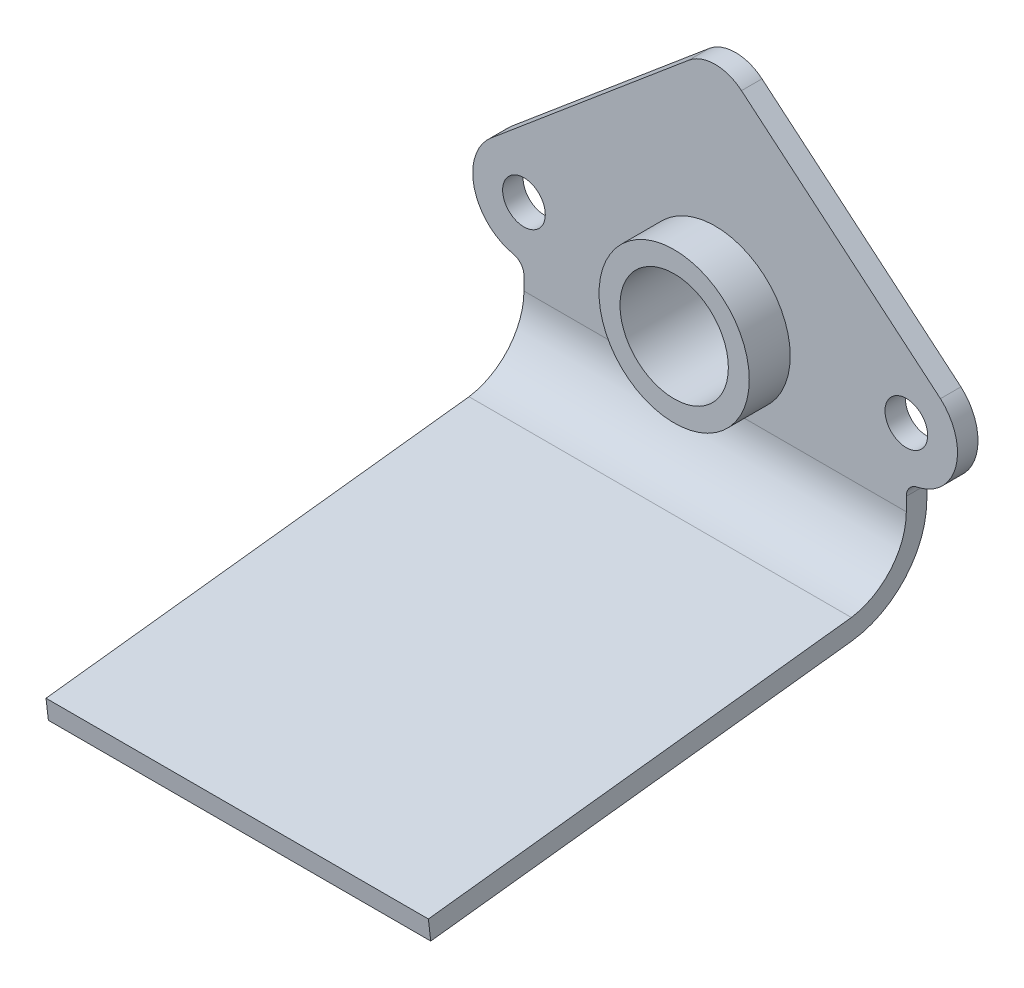
ISO-10303-21;
HEADER;
FILE_DESCRIPTION(('STEP AP214'),'2;1');
FILE_NAME('part.step','',(''),(''),'','','');
FILE_SCHEMA(('AUTOMOTIVE_DESIGN { 1 0 10303 214 1 1 1 1 }'));
ENDSEC;
DATA;
#1=APPLICATION_CONTEXT('core data for automotive mechanical design processes');
#2=APPLICATION_PROTOCOL_DEFINITION('international standard','automotive_design',2000,#1);
#3=PRODUCT_CONTEXT('',#1,'mechanical');
#4=PRODUCT('Part','Part','',(#3));
#5=PRODUCT_RELATED_PRODUCT_CATEGORY('part','',(#4));
#6=PRODUCT_DEFINITION_FORMATION('','',#4);
#7=PRODUCT_DEFINITION_CONTEXT('part definition',#1,'design');
#8=PRODUCT_DEFINITION('design','',#6,#7);
#9=PRODUCT_DEFINITION_SHAPE('','',#8);
#10=(LENGTH_UNIT() NAMED_UNIT(*) SI_UNIT(.MILLI.,.METRE.));
#11=(NAMED_UNIT(*) PLANE_ANGLE_UNIT() SI_UNIT($,.RADIAN.));
#12=(NAMED_UNIT(*) SI_UNIT($,.STERADIAN.) SOLID_ANGLE_UNIT());
#13=UNCERTAINTY_MEASURE_WITH_UNIT(LENGTH_MEASURE(1.E-05),#10,'distance_accuracy_value','');
#14=(GEOMETRIC_REPRESENTATION_CONTEXT(3) GLOBAL_UNCERTAINTY_ASSIGNED_CONTEXT((#13)) GLOBAL_UNIT_ASSIGNED_CONTEXT((#10,
#11,#12)) REPRESENTATION_CONTEXT('',''));
#15=CARTESIAN_POINT('',(0.,0.,0.));
#16=DIRECTION('',(0.,0.,1.));
#17=DIRECTION('',(1.,0.,0.));
#18=AXIS2_PLACEMENT_3D('',#15,#16,#17);
#19=CARTESIAN_POINT('',(0.,0.,3.));
#20=DIRECTION('',(0.,0.,1.));
#21=DIRECTION('',(1.,0.,0.));
#22=AXIS2_PLACEMENT_3D('',#19,#20,#21);
#23=PLANE('',#22);
#24=DIRECTION('',(0.,-1.,0.));
#25=VECTOR('',#24,1.);
#26=CARTESIAN_POINT('',(28.,0.,3.));
#27=LINE('',#26,#25);
#28=CARTESIAN_POINT('',(28.,-9.28708781050336,3.));
#29=VERTEX_POINT('',#28);
#30=CARTESIAN_POINT('',(28.,-11.25,3.));
#31=VERTEX_POINT('',#30);
#32=EDGE_CURVE('E228',#29,#31,#27,.T.);
#33=ORIENTED_EDGE('',*,*,#32,.F.);
#34=CARTESIAN_POINT('',(30.,-9.28708781050336,3.));
#35=DIRECTION('',(0.,0.,1.));
#36=DIRECTION('',(1.,0.,0.));
#37=AXIS2_PLACEMENT_3D('',#34,#35,#36);
#38=CIRCLE('',#37,2.);
#39=CARTESIAN_POINT('',(29.5789473684211,-7.33191142934476,3.));
#40=VERTEX_POINT('',#39);
#41=EDGE_CURVE('E325',#29,#40,#38,.F.);
#42=ORIENTED_EDGE('',*,*,#41,.T.);
#43=CARTESIAN_POINT('',(28.,0.,3.));
#44=DIRECTION('',(0.,0.,1.));
#45=DIRECTION('',(1.,0.,0.));
#46=AXIS2_PLACEMENT_3D('',#43,#44,#45);
#47=CIRCLE('',#46,7.5);
#48=CARTESIAN_POINT('',(32.9978334745954,5.5921069875507,3.));
#49=VERTEX_POINT('',#48);
#50=EDGE_CURVE('E231',#40,#49,#47,.T.);
#51=ORIENTED_EDGE('',*,*,#50,.T.);
#52=DIRECTION('',(0.765373193581279,-0.6435867265157,0.));
#53=VECTOR('',#52,1.);
#54=CARTESIAN_POINT('',(16.4224130630046,19.5300403418685,3.));
#55=LINE('',#54,#53);
#56=CARTESIAN_POINT('',(3.86110629673899,30.0925873062232,3.));
#57=VERTEX_POINT('',#56);
#58=EDGE_CURVE('E234',#57,#49,#55,.T.);
#59=ORIENTED_EDGE('',*,*,#58,.F.);
#60=CARTESIAN_POINT('',(0.,25.5,3.));
#61=DIRECTION('',(0.,0.,1.));
#62=DIRECTION('',(1.,0.,0.));
#63=AXIS2_PLACEMENT_3D('',#60,#61,#62);
#64=CIRCLE('',#63,6.);
#65=CARTESIAN_POINT('',(-3.86110629673899,30.0925873062232,3.));
#66=VERTEX_POINT('',#65);
#67=EDGE_CURVE('E238',#57,#66,#64,.T.);
#68=ORIENTED_EDGE('',*,*,#67,.T.);
#69=DIRECTION('',(-0.765431217703868,-0.643517716123165,0.));
#70=VECTOR('',#69,1.);
#71=CARTESIAN_POINT('',(-16.4216042979262,19.5326535066317,3.));
#72=LINE('',#71,#70);
#73=CARTESIAN_POINT('',(-32.8263828709237,5.74073413277901,3.));
#74=VERTEX_POINT('',#73);
#75=EDGE_CURVE('E242',#66,#74,#72,.T.);
#76=ORIENTED_EDGE('',*,*,#75,.T.);
#77=CARTESIAN_POINT('',(-28.,0.,3.));
#78=DIRECTION('',(0.,0.,1.));
#79=DIRECTION('',(1.,0.,0.));
#80=AXIS2_PLACEMENT_3D('',#77,#78,#79);
#81=CIRCLE('',#80,7.5);
#82=CARTESIAN_POINT('',(-29.5789473684211,-7.33191142934475,3.));
#83=VERTEX_POINT('',#82);
#84=EDGE_CURVE('E246',#74,#83,#81,.T.);
#85=ORIENTED_EDGE('',*,*,#84,.T.);
#86=CARTESIAN_POINT('',(-30.,-9.28708781050335,3.));
#87=DIRECTION('',(0.,0.,1.));
#88=DIRECTION('',(1.,0.,0.));
#89=AXIS2_PLACEMENT_3D('',#86,#87,#88);
#90=CIRCLE('',#89,2.);
#91=CARTESIAN_POINT('',(-28.,-9.28708781050335,3.));
#92=VERTEX_POINT('',#91);
#93=EDGE_CURVE('E12',#83,#92,#90,.F.);
#94=ORIENTED_EDGE('',*,*,#93,.T.);
#95=DIRECTION('',(0.,-1.,0.));
#96=VECTOR('',#95,1.);
#97=CARTESIAN_POINT('',(-28.,0.,3.));
#98=LINE('',#97,#96);
#99=CARTESIAN_POINT('',(-28.,-11.25,3.));
#100=VERTEX_POINT('',#99);
#101=EDGE_CURVE('E249',#92,#100,#98,.T.);
#102=ORIENTED_EDGE('',*,*,#101,.T.);
#103=DIRECTION('',(1.,0.,0.));
#104=VECTOR('',#103,1.);
#105=CARTESIAN_POINT('',(0.,-11.25,3.));
#106=LINE('',#105,#104);
#107=EDGE_CURVE('E252',#100,#31,#106,.T.);
#108=ORIENTED_EDGE('',*,*,#107,.T.);
#109=EDGE_LOOP('',(#33,#42,#51,#59,#68,#76,#85,#94,#102,#108));
#110=FACE_BOUND('',#109,.T.);
#111=CARTESIAN_POINT('',(28.,0.,3.));
#112=DIRECTION('',(0.,0.,1.));
#113=DIRECTION('',(1.,0.,0.));
#114=AXIS2_PLACEMENT_3D('',#111,#112,#113);
#115=CIRCLE('',#114,3.125);
#116=CARTESIAN_POINT('',(31.125,0.,3.));
#117=VERTEX_POINT('',#116);
#118=EDGE_CURVE('E223',#117,#117,#115,.T.);
#119=ORIENTED_EDGE('',*,*,#118,.F.);
#120=EDGE_LOOP('',(#119));
#121=FACE_BOUND('',#120,.T.);
#122=CARTESIAN_POINT('',(-28.,0.,3.));
#123=DIRECTION('',(0.,0.,1.));
#124=DIRECTION('',(1.,0.,0.));
#125=AXIS2_PLACEMENT_3D('',#122,#123,#124);
#126=CIRCLE('',#125,3.125);
#127=CARTESIAN_POINT('',(-24.875,0.,3.));
#128=VERTEX_POINT('',#127);
#129=EDGE_CURVE('E219',#128,#128,#126,.T.);
#130=ORIENTED_EDGE('',*,*,#129,.F.);
#131=EDGE_LOOP('',(#130));
#132=FACE_BOUND('',#131,.T.);
#133=CARTESIAN_POINT('',(0.,0.,3.));
#134=DIRECTION('',(0.,0.,1.));
#135=DIRECTION('',(1.,0.,0.));
#136=AXIS2_PLACEMENT_3D('',#133,#134,#135);
#137=CIRCLE('',#136,11.);
#138=CARTESIAN_POINT('',(11.,0.,3.));
#139=VERTEX_POINT('',#138);
#140=EDGE_CURVE('E202',#139,#139,#137,.T.);
#141=ORIENTED_EDGE('',*,*,#140,.F.);
#142=EDGE_LOOP('',(#141));
#143=FACE_BOUND('',#142,.T.);
#144=ADVANCED_FACE('F52',(#110,#121,#132,#143),#23,.T.);
#145=CARTESIAN_POINT('',(0.,0.,0.));
#146=DIRECTION('',(0.,0.,1.));
#147=DIRECTION('',(1.,0.,0.));
#148=AXIS2_PLACEMENT_3D('',#145,#146,#147);
#149=PLANE('',#148);
#150=CARTESIAN_POINT('',(28.,0.,0.));
#151=DIRECTION('',(0.,0.,1.));
#152=DIRECTION('',(1.,0.,0.));
#153=AXIS2_PLACEMENT_3D('',#150,#151,#152);
#154=CIRCLE('',#153,7.5);
#155=CARTESIAN_POINT('',(29.5789473684211,-7.33191142934476,0.));
#156=VERTEX_POINT('',#155);
#157=CARTESIAN_POINT('',(32.9978334745954,5.5921069875507,0.));
#158=VERTEX_POINT('',#157);
#159=EDGE_CURVE('E267',#156,#158,#154,.T.);
#160=ORIENTED_EDGE('',*,*,#159,.F.);
#161=CARTESIAN_POINT('',(30.,-9.28708781050336,0.));
#162=DIRECTION('',(0.,0.,1.));
#163=DIRECTION('',(1.,0.,0.));
#164=AXIS2_PLACEMENT_3D('',#161,#162,#163);
#165=CIRCLE('',#164,2.);
#166=CARTESIAN_POINT('',(28.,-9.28708781050336,0.));
#167=VERTEX_POINT('',#166);
#168=EDGE_CURVE('E322',#156,#167,#165,.T.);
#169=ORIENTED_EDGE('',*,*,#168,.T.);
#170=DIRECTION('',(0.,-1.,0.));
#171=VECTOR('',#170,1.);
#172=CARTESIAN_POINT('',(28.,0.,0.));
#173=LINE('',#172,#171);
#174=CARTESIAN_POINT('',(28.,-11.25,0.));
#175=VERTEX_POINT('',#174);
#176=EDGE_CURVE('E264',#167,#175,#173,.T.);
#177=ORIENTED_EDGE('',*,*,#176,.T.);
#178=DIRECTION('',(1.,0.,0.));
#179=VECTOR('',#178,1.);
#180=CARTESIAN_POINT('',(0.,-11.25,0.));
#181=LINE('',#180,#179);
#182=CARTESIAN_POINT('',(-28.,-11.2500000000001,0.));
#183=VERTEX_POINT('',#182);
#184=EDGE_CURVE('E224',#183,#175,#181,.T.);
#185=ORIENTED_EDGE('',*,*,#184,.F.);
#186=DIRECTION('',(0.,-1.,0.));
#187=VECTOR('',#186,1.);
#188=CARTESIAN_POINT('',(-28.,0.,0.));
#189=LINE('',#188,#187);
#190=CARTESIAN_POINT('',(-28.,-9.28708781050335,0.));
#191=VERTEX_POINT('',#190);
#192=EDGE_CURVE('E285',#191,#183,#189,.T.);
#193=ORIENTED_EDGE('',*,*,#192,.F.);
#194=CARTESIAN_POINT('',(-30.,-9.28708781050335,0.));
#195=DIRECTION('',(0.,0.,1.));
#196=DIRECTION('',(1.,0.,0.));
#197=AXIS2_PLACEMENT_3D('',#194,#195,#196);
#198=CIRCLE('',#197,2.);
#199=CARTESIAN_POINT('',(-29.5789473684211,-7.33191142934475,0.));
#200=VERTEX_POINT('',#199);
#201=EDGE_CURVE('E61',#191,#200,#198,.T.);
#202=ORIENTED_EDGE('',*,*,#201,.T.);
#203=CARTESIAN_POINT('',(-28.,0.,0.));
#204=DIRECTION('',(0.,0.,1.));
#205=DIRECTION('',(1.,0.,0.));
#206=AXIS2_PLACEMENT_3D('',#203,#204,#205);
#207=CIRCLE('',#206,7.5);
#208=CARTESIAN_POINT('',(-32.8263828709237,5.74073413277901,0.));
#209=VERTEX_POINT('',#208);
#210=EDGE_CURVE('E282',#209,#200,#207,.T.);
#211=ORIENTED_EDGE('',*,*,#210,.F.);
#212=DIRECTION('',(-0.765431217703868,-0.643517716123165,0.));
#213=VECTOR('',#212,1.);
#214=CARTESIAN_POINT('',(-16.4216042979262,19.5326535066317,0.));
#215=LINE('',#214,#213);
#216=CARTESIAN_POINT('',(-3.86110629673899,30.0925873062232,0.));
#217=VERTEX_POINT('',#216);
#218=EDGE_CURVE('E278',#217,#209,#215,.T.);
#219=ORIENTED_EDGE('',*,*,#218,.F.);
#220=CARTESIAN_POINT('',(0.,25.5,0.));
#221=DIRECTION('',(0.,0.,1.));
#222=DIRECTION('',(1.,0.,0.));
#223=AXIS2_PLACEMENT_3D('',#220,#221,#222);
#224=CIRCLE('',#223,6.);
#225=CARTESIAN_POINT('',(3.86110629673899,30.0925873062232,0.));
#226=VERTEX_POINT('',#225);
#227=EDGE_CURVE('E274',#226,#217,#224,.T.);
#228=ORIENTED_EDGE('',*,*,#227,.F.);
#229=DIRECTION('',(0.765373193581279,-0.6435867265157,0.));
#230=VECTOR('',#229,1.);
#231=CARTESIAN_POINT('',(16.4224130630046,19.5300403418685,0.));
#232=LINE('',#231,#230);
#233=EDGE_CURVE('E270',#226,#158,#232,.T.);
#234=ORIENTED_EDGE('',*,*,#233,.T.);
#235=EDGE_LOOP('',(#160,#169,#177,#185,#193,#202,#211,#219,#228,#234));
#236=FACE_BOUND('',#235,.T.);
#237=CARTESIAN_POINT('',(28.,0.,0.));
#238=DIRECTION('',(0.,0.,1.));
#239=DIRECTION('',(1.,0.,0.));
#240=AXIS2_PLACEMENT_3D('',#237,#238,#239);
#241=CIRCLE('',#240,3.125);
#242=CARTESIAN_POINT('',(31.125,0.,0.));
#243=VERTEX_POINT('',#242);
#244=EDGE_CURVE('E260',#243,#243,#241,.T.);
#245=ORIENTED_EDGE('',*,*,#244,.T.);
#246=EDGE_LOOP('',(#245));
#247=FACE_BOUND('',#246,.T.);
#248=CARTESIAN_POINT('',(-28.,0.,0.));
#249=DIRECTION('',(0.,0.,1.));
#250=DIRECTION('',(1.,0.,0.));
#251=AXIS2_PLACEMENT_3D('',#248,#249,#250);
#252=CIRCLE('',#251,3.125);
#253=CARTESIAN_POINT('',(-24.875,0.,0.));
#254=VERTEX_POINT('',#253);
#255=EDGE_CURVE('E218',#254,#254,#252,.T.);
#256=ORIENTED_EDGE('',*,*,#255,.T.);
#257=EDGE_LOOP('',(#256));
#258=FACE_BOUND('',#257,.T.);
#259=CARTESIAN_POINT('',(0.,0.,0.));
#260=DIRECTION('',(0.,0.,1.));
#261=DIRECTION('',(1.,0.,0.));
#262=AXIS2_PLACEMENT_3D('',#259,#260,#261);
#263=CIRCLE('',#262,11.);
#264=CARTESIAN_POINT('',(11.,0.,0.));
#265=VERTEX_POINT('',#264);
#266=EDGE_CURVE('E305',#265,#265,#263,.F.);
#267=ORIENTED_EDGE('',*,*,#266,.F.);
#268=EDGE_LOOP('',(#267));
#269=FACE_BOUND('',#268,.T.);
#270=ADVANCED_FACE('F358',(#236,#247,#258,#269),#149,.F.);
#271=CARTESIAN_POINT('',(28.,0.,3.));
#272=DIRECTION('',(1.,0.,0.));
#273=DIRECTION('',(0.,0.,-1.));
#274=AXIS2_PLACEMENT_3D('',#271,#272,#273);
#275=PLANE('',#274);
#276=ORIENTED_EDGE('',*,*,#176,.F.);
#277=DIRECTION('',(0.,0.,-1.));
#278=VECTOR('',#277,1.);
#279=CARTESIAN_POINT('',(28.,-9.28708781050336,3.));
#280=LINE('',#279,#278);
#281=EDGE_CURVE('E313',#167,#29,#280,.F.);
#282=ORIENTED_EDGE('',*,*,#281,.T.);
#283=ORIENTED_EDGE('',*,*,#32,.T.);
#284=CARTESIAN_POINT('',(28.,-11.25,12.5));
#285=DIRECTION('',(1.,0.,0.));
#286=DIRECTION('',(0.,0.,-1.));
#287=AXIS2_PLACEMENT_3D('',#284,#285,#286);
#288=CIRCLE('',#287,9.5);
#289=CARTESIAN_POINT('',(28.,-20.6380832623958,11.0460768045307));
#290=VERTEX_POINT('',#289);
#291=EDGE_CURVE('E181',#31,#290,#288,.F.);
#292=ORIENTED_EDGE('',*,*,#291,.T.);
#293=DIRECTION('',(0.,0.116417778690367,-0.993200332664464));
#294=VECTOR('',#293,1.);
#295=CARTESIAN_POINT('',(28.,-27.9,73.));
#296=LINE('',#295,#294);
#297=CARTESIAN_POINT('',(28.,-27.9,73.));
#298=VERTEX_POINT('',#297);
#299=EDGE_CURVE('E170',#298,#290,#296,.T.);
#300=ORIENTED_EDGE('',*,*,#299,.F.);
#301=DIRECTION('',(0.,-0.993212508472749,-0.11631385563754));
#302=VECTOR('',#301,1.);
#303=CARTESIAN_POINT('',(28.,-27.9,73.));
#304=LINE('',#303,#302);
#305=CARTESIAN_POINT('',(28.,-30.8796375254182,72.6510584330874));
#306=VERTEX_POINT('',#305);
#307=EDGE_CURVE('E152',#298,#306,#304,.T.);
#308=ORIENTED_EDGE('',*,*,#307,.T.);
#309=DIRECTION('',(0.,0.11631385563754,-0.993212508472749));
#310=VECTOR('',#309,1.);
#311=CARTESIAN_POINT('',(28.,-30.8796375254182,72.6510584330874));
#312=LINE('',#311,#310);
#313=CARTESIAN_POINT('',(28.,-23.6651563559094,11.0460768045307));
#314=VERTEX_POINT('',#313);
#315=EDGE_CURVE('E163',#306,#314,#312,.T.);
#316=ORIENTED_EDGE('',*,*,#315,.T.);
#317=CARTESIAN_POINT('',(28.,-11.25,12.5));
#318=DIRECTION('',(1.,0.,0.));
#319=DIRECTION('',(0.,0.,-1.));
#320=AXIS2_PLACEMENT_3D('',#317,#318,#319);
#321=CIRCLE('',#320,12.5000000000001);
#322=EDGE_CURVE('E197',#175,#314,#321,.F.);
#323=ORIENTED_EDGE('',*,*,#322,.F.);
#324=EDGE_LOOP('',(#276,#282,#283,#292,#300,#308,#316,#323));
#325=FACE_BOUND('',#324,.T.);
#326=ADVANCED_FACE('F179',(#325),#275,.T.);
#327=CARTESIAN_POINT('',(28.,0.,3.));
#328=DIRECTION('',(0.,0.,-1.));
#329=DIRECTION('',(-1.,0.,0.));
#330=AXIS2_PLACEMENT_3D('',#327,#328,#329);
#331=CYLINDRICAL_SURFACE('',#330,7.5);
#332=ORIENTED_EDGE('',*,*,#50,.F.);
#333=DIRECTION('',(0.,0.,-1.));
#334=VECTOR('',#333,1.);
#335=CARTESIAN_POINT('',(29.5789473684211,-7.33191142934476,3.));
#336=LINE('',#335,#334);
#337=EDGE_CURVE('E309',#40,#156,#336,.T.);
#338=ORIENTED_EDGE('',*,*,#337,.T.);
#339=ORIENTED_EDGE('',*,*,#159,.T.);
#340=DIRECTION('',(0.,0.,-1.));
#341=VECTOR('',#340,1.);
#342=CARTESIAN_POINT('',(32.9978334745954,5.5921069875507,3.));
#343=LINE('',#342,#341);
#344=EDGE_CURVE('E301',#49,#158,#343,.T.);
#345=ORIENTED_EDGE('',*,*,#344,.F.);
#346=EDGE_LOOP('',(#332,#338,#339,#345));
#347=FACE_BOUND('',#346,.T.);
#348=ADVANCED_FACE('F366',(#347),#331,.T.);
#349=CARTESIAN_POINT('',(16.4224130630046,19.5300403418685,3.));
#350=DIRECTION('',(0.6435867265157,0.765373193581279,0.));
#351=DIRECTION('',(-0.765373193581279,0.6435867265157,0.));
#352=AXIS2_PLACEMENT_3D('',#349,#350,#351);
#353=PLANE('',#352);
#354=ORIENTED_EDGE('',*,*,#233,.F.);
#355=DIRECTION('',(0.,0.,-1.));
#356=VECTOR('',#355,1.);
#357=CARTESIAN_POINT('',(3.86110629673899,30.0925873062232,3.));
#358=LINE('',#357,#356);
#359=EDGE_CURVE('E298',#57,#226,#358,.T.);
#360=ORIENTED_EDGE('',*,*,#359,.F.);
#361=ORIENTED_EDGE('',*,*,#58,.T.);
#362=ORIENTED_EDGE('',*,*,#344,.T.);
#363=EDGE_LOOP('',(#354,#360,#361,#362));
#364=FACE_BOUND('',#363,.T.);
#365=ADVANCED_FACE('F388',(#364),#353,.T.);
#366=CARTESIAN_POINT('',(0.,25.5,3.));
#367=DIRECTION('',(0.,0.,-1.));
#368=DIRECTION('',(-1.,0.,0.));
#369=AXIS2_PLACEMENT_3D('',#366,#367,#368);
#370=CYLINDRICAL_SURFACE('',#369,6.);
#371=ORIENTED_EDGE('',*,*,#227,.T.);
#372=DIRECTION('',(0.,0.,-1.));
#373=VECTOR('',#372,1.);
#374=CARTESIAN_POINT('',(-3.86110629673899,30.0925873062232,3.));
#375=LINE('',#374,#373);
#376=EDGE_CURVE('E294',#66,#217,#375,.T.);
#377=ORIENTED_EDGE('',*,*,#376,.F.);
#378=ORIENTED_EDGE('',*,*,#67,.F.);
#379=ORIENTED_EDGE('',*,*,#359,.T.);
#380=EDGE_LOOP('',(#371,#377,#378,#379));
#381=FACE_BOUND('',#380,.T.);
#382=ADVANCED_FACE('F390',(#381),#370,.T.);
#383=CARTESIAN_POINT('',(-16.4216042979262,19.5326535066317,3.));
#384=DIRECTION('',(0.643517716123165,-0.765431217703867,0.));
#385=DIRECTION('',(0.765431217703868,0.643517716123165,0.));
#386=AXIS2_PLACEMENT_3D('',#383,#384,#385);
#387=PLANE('',#386);
#388=ORIENTED_EDGE('',*,*,#218,.T.);
#389=DIRECTION('',(0.,0.,-1.));
#390=VECTOR('',#389,1.);
#391=CARTESIAN_POINT('',(-32.8263828709237,5.74073413277901,3.));
#392=LINE('',#391,#390);
#393=EDGE_CURVE('E256',#74,#209,#392,.T.);
#394=ORIENTED_EDGE('',*,*,#393,.F.);
#395=ORIENTED_EDGE('',*,*,#75,.F.);
#396=ORIENTED_EDGE('',*,*,#376,.T.);
#397=EDGE_LOOP('',(#388,#394,#395,#396));
#398=FACE_BOUND('',#397,.T.);
#399=ADVANCED_FACE('F382',(#398),#387,.F.);
#400=CARTESIAN_POINT('',(-28.,0.,3.));
#401=DIRECTION('',(0.,0.,-1.));
#402=DIRECTION('',(-1.,0.,0.));
#403=AXIS2_PLACEMENT_3D('',#400,#401,#402);
#404=CYLINDRICAL_SURFACE('',#403,7.5);
#405=ORIENTED_EDGE('',*,*,#210,.T.);
#406=DIRECTION('',(0.,0.,-1.));
#407=VECTOR('',#406,1.);
#408=CARTESIAN_POINT('',(-29.5789473684211,-7.33191142934475,3.));
#409=LINE('',#408,#407);
#410=EDGE_CURVE('E68',#200,#83,#409,.F.);
#411=ORIENTED_EDGE('',*,*,#410,.T.);
#412=ORIENTED_EDGE('',*,*,#84,.F.);
#413=ORIENTED_EDGE('',*,*,#393,.T.);
#414=EDGE_LOOP('',(#405,#411,#412,#413));
#415=FACE_BOUND('',#414,.T.);
#416=ADVANCED_FACE('F380',(#415),#404,.T.);
#417=CARTESIAN_POINT('',(-28.,0.,3.));
#418=DIRECTION('',(1.,0.,0.));
#419=DIRECTION('',(0.,0.,-1.));
#420=AXIS2_PLACEMENT_3D('',#417,#418,#419);
#421=PLANE('',#420);
#422=ORIENTED_EDGE('',*,*,#101,.F.);
#423=DIRECTION('',(0.,0.,1.));
#424=VECTOR('',#423,1.);
#425=CARTESIAN_POINT('',(-28.,-9.28708781050335,0.));
#426=LINE('',#425,#424);
#427=EDGE_CURVE('E316',#92,#191,#426,.F.);
#428=ORIENTED_EDGE('',*,*,#427,.T.);
#429=ORIENTED_EDGE('',*,*,#192,.T.);
#430=CARTESIAN_POINT('',(-28.,-11.25,12.5));
#431=DIRECTION('',(-1.,0.,0.));
#432=DIRECTION('',(0.,0.,1.));
#433=AXIS2_PLACEMENT_3D('',#430,#431,#432);
#434=CIRCLE('',#433,12.5000000000001);
#435=CARTESIAN_POINT('',(-28.,-23.6651563559094,11.0460768045307));
#436=VERTEX_POINT('',#435);
#437=EDGE_CURVE('E164',#183,#436,#434,.T.);
#438=ORIENTED_EDGE('',*,*,#437,.T.);
#439=DIRECTION('',(0.,0.11631385563754,-0.993212508472748));
#440=VECTOR('',#439,1.);
#441=CARTESIAN_POINT('',(-28.,-30.8796375254182,72.6510584330874));
#442=LINE('',#441,#440);
#443=CARTESIAN_POINT('',(-28.,-30.8796375254182,72.6510584330874));
#444=VERTEX_POINT('',#443);
#445=EDGE_CURVE('E193',#444,#436,#442,.T.);
#446=ORIENTED_EDGE('',*,*,#445,.F.);
#447=DIRECTION('',(0.,-0.993212508472749,-0.11631385563754));
#448=VECTOR('',#447,1.);
#449=CARTESIAN_POINT('',(-28.,-27.9,73.));
#450=LINE('',#449,#448);
#451=CARTESIAN_POINT('',(-28.,-27.9,73.));
#452=VERTEX_POINT('',#451);
#453=EDGE_CURVE('E175',#452,#444,#450,.T.);
#454=ORIENTED_EDGE('',*,*,#453,.F.);
#455=DIRECTION('',(0.,0.116417778690367,-0.993200332664464));
#456=VECTOR('',#455,1.);
#457=CARTESIAN_POINT('',(-28.,-27.9,73.));
#458=LINE('',#457,#456);
#459=CARTESIAN_POINT('',(-28.,-20.6380832623958,11.0460768045307));
#460=VERTEX_POINT('',#459);
#461=EDGE_CURVE('E173',#452,#460,#458,.T.);
#462=ORIENTED_EDGE('',*,*,#461,.T.);
#463=CARTESIAN_POINT('',(-28.,-11.25,12.5));
#464=DIRECTION('',(-1.,0.,0.));
#465=DIRECTION('',(0.,0.,1.));
#466=AXIS2_PLACEMENT_3D('',#463,#464,#465);
#467=CIRCLE('',#466,9.5);
#468=EDGE_CURVE('E196',#100,#460,#467,.T.);
#469=ORIENTED_EDGE('',*,*,#468,.F.);
#470=EDGE_LOOP('',(#422,#428,#429,#438,#446,#454,#462,#469));
#471=FACE_BOUND('',#470,.T.);
#472=ADVANCED_FACE('F347',(#471),#421,.F.);
#473=CARTESIAN_POINT('',(28.,0.,3.));
#474=DIRECTION('',(0.,0.,-1.));
#475=DIRECTION('',(-1.,0.,0.));
#476=AXIS2_PLACEMENT_3D('',#473,#474,#475);
#477=CYLINDRICAL_SURFACE('',#476,3.125);
#478=ORIENTED_EDGE('',*,*,#118,.T.);
#479=EDGE_LOOP('',(#478));
#480=FACE_BOUND('',#479,.T.);
#481=ORIENTED_EDGE('',*,*,#244,.F.);
#482=EDGE_LOOP('',(#481));
#483=FACE_BOUND('',#482,.T.);
#484=ADVANCED_FACE('F418',(#480,#483),#477,.F.);
#485=CARTESIAN_POINT('',(-28.,0.,3.));
#486=DIRECTION('',(0.,0.,-1.));
#487=DIRECTION('',(-1.,0.,0.));
#488=AXIS2_PLACEMENT_3D('',#485,#486,#487);
#489=CYLINDRICAL_SURFACE('',#488,3.125);
#490=ORIENTED_EDGE('',*,*,#129,.T.);
#491=EDGE_LOOP('',(#490));
#492=FACE_BOUND('',#491,.T.);
#493=ORIENTED_EDGE('',*,*,#255,.F.);
#494=EDGE_LOOP('',(#493));
#495=FACE_BOUND('',#494,.T.);
#496=ADVANCED_FACE('F414',(#492,#495),#489,.F.);
#497=CARTESIAN_POINT('',(0.,0.,3.));
#498=DIRECTION('',(0.,0.,-1.));
#499=DIRECTION('',(-1.,0.,0.));
#500=AXIS2_PLACEMENT_3D('',#497,#498,#499);
#501=CYLINDRICAL_SURFACE('',#500,7.9375);
#502=CARTESIAN_POINT('',(0.,0.,-6.));
#503=DIRECTION('',(0.,0.,-1.));
#504=DIRECTION('',(-1.,0.,0.));
#505=AXIS2_PLACEMENT_3D('',#502,#503,#504);
#506=CIRCLE('',#505,7.9375);
#507=CARTESIAN_POINT('',(-7.9375,0.,-6.));
#508=VERTEX_POINT('',#507);
#509=EDGE_CURVE('E207',#508,#508,#506,.T.);
#510=ORIENTED_EDGE('',*,*,#509,.T.);
#511=EDGE_LOOP('',(#510));
#512=FACE_BOUND('',#511,.T.);
#513=CARTESIAN_POINT('',(0.,0.,9.));
#514=DIRECTION('',(0.,0.,1.));
#515=DIRECTION('',(1.,0.,0.));
#516=AXIS2_PLACEMENT_3D('',#513,#514,#515);
#517=CIRCLE('',#516,7.9375);
#518=CARTESIAN_POINT('',(7.9375,0.,9.));
#519=VERTEX_POINT('',#518);
#520=EDGE_CURVE('E189',#519,#519,#517,.T.);
#521=ORIENTED_EDGE('',*,*,#520,.T.);
#522=EDGE_LOOP('',(#521));
#523=FACE_BOUND('',#522,.T.);
#524=ADVANCED_FACE('F410',(#512,#523),#501,.F.);
#525=CARTESIAN_POINT('',(0.,0.,-6.));
#526=DIRECTION('',(0.,0.,-1.));
#527=DIRECTION('',(-1.,0.,0.));
#528=AXIS2_PLACEMENT_3D('',#525,#526,#527);
#529=PLANE('',#528);
#530=CARTESIAN_POINT('',(0.,0.,-6.));
#531=DIRECTION('',(0.,0.,-1.));
#532=DIRECTION('',(-1.,0.,0.));
#533=AXIS2_PLACEMENT_3D('',#530,#531,#532);
#534=CIRCLE('',#533,11.);
#535=CARTESIAN_POINT('',(-11.,0.,-6.));
#536=VERTEX_POINT('',#535);
#537=EDGE_CURVE('E214',#536,#536,#534,.T.);
#538=ORIENTED_EDGE('',*,*,#537,.T.);
#539=EDGE_LOOP('',(#538));
#540=FACE_BOUND('',#539,.T.);
#541=ORIENTED_EDGE('',*,*,#509,.F.);
#542=EDGE_LOOP('',(#541));
#543=FACE_BOUND('',#542,.T.);
#544=ADVANCED_FACE('F413',(#540,#543),#529,.T.);
#545=CARTESIAN_POINT('',(0.,0.,-6.));
#546=DIRECTION('',(0.,0.,1.));
#547=DIRECTION('',(1.,0.,0.));
#548=AXIS2_PLACEMENT_3D('',#545,#546,#547);
#549=CYLINDRICAL_SURFACE('',#548,11.);
#550=ORIENTED_EDGE('',*,*,#537,.F.);
#551=EDGE_LOOP('',(#550));
#552=FACE_BOUND('',#551,.T.);
#553=ORIENTED_EDGE('',*,*,#266,.T.);
#554=EDGE_LOOP('',(#553));
#555=FACE_BOUND('',#554,.T.);
#556=ADVANCED_FACE('F407',(#552,#555),#549,.T.);
#557=CARTESIAN_POINT('',(0.,0.,9.));
#558=DIRECTION('',(0.,0.,1.));
#559=DIRECTION('',(1.,0.,0.));
#560=AXIS2_PLACEMENT_3D('',#557,#558,#559);
#561=PLANE('',#560);
#562=CARTESIAN_POINT('',(0.,0.,9.));
#563=DIRECTION('',(0.,0.,1.));
#564=DIRECTION('',(1.,0.,0.));
#565=AXIS2_PLACEMENT_3D('',#562,#563,#564);
#566=CIRCLE('',#565,11.);
#567=CARTESIAN_POINT('',(11.,0.,9.));
#568=VERTEX_POINT('',#567);
#569=EDGE_CURVE('E203',#568,#568,#566,.T.);
#570=ORIENTED_EDGE('',*,*,#569,.T.);
#571=EDGE_LOOP('',(#570));
#572=FACE_BOUND('',#571,.T.);
#573=ORIENTED_EDGE('',*,*,#520,.F.);
#574=EDGE_LOOP('',(#573));
#575=FACE_BOUND('',#574,.T.);
#576=ADVANCED_FACE('F491',(#572,#575),#561,.T.);
#577=CARTESIAN_POINT('',(0.,0.,9.));
#578=DIRECTION('',(0.,0.,-1.));
#579=DIRECTION('',(-1.,0.,0.));
#580=AXIS2_PLACEMENT_3D('',#577,#578,#579);
#581=CYLINDRICAL_SURFACE('',#580,11.);
#582=ORIENTED_EDGE('',*,*,#569,.F.);
#583=EDGE_LOOP('',(#582));
#584=FACE_BOUND('',#583,.T.);
#585=ORIENTED_EDGE('',*,*,#140,.T.);
#586=EDGE_LOOP('',(#585));
#587=FACE_BOUND('',#586,.T.);
#588=ADVANCED_FACE('F483',(#584,#587),#581,.T.);
#589=CARTESIAN_POINT('',(103.593139036419,-27.9,73.));
#590=DIRECTION('',(0.,0.993200332664464,0.116417778690367));
#591=DIRECTION('',(0.,-0.116417778690367,0.993200332664464));
#592=AXIS2_PLACEMENT_3D('',#589,#590,#591);
#593=PLANE('',#592);
#594=DIRECTION('',(-1.,0.,0.));
#595=VECTOR('',#594,1.);
#596=CARTESIAN_POINT('',(103.593139036419,-27.9,73.));
#597=LINE('',#596,#595);
#598=EDGE_CURVE('E156',#298,#452,#597,.T.);
#599=ORIENTED_EDGE('',*,*,#598,.F.);
#600=ORIENTED_EDGE('',*,*,#299,.T.);
#601=DIRECTION('',(-1.,0.,0.));
#602=VECTOR('',#601,1.);
#603=CARTESIAN_POINT('',(103.593139036419,-20.6380832623958,11.0460768045307));
#604=LINE('',#603,#602);
#605=EDGE_CURVE('E176',#290,#460,#604,.T.);
#606=ORIENTED_EDGE('',*,*,#605,.T.);
#607=ORIENTED_EDGE('',*,*,#461,.F.);
#608=EDGE_LOOP('',(#599,#600,#606,#607));
#609=FACE_BOUND('',#608,.T.);
#610=ADVANCED_FACE('F169',(#609),#593,.T.);
#611=CARTESIAN_POINT('',(103.593139036419,-27.9,73.));
#612=DIRECTION('',(0.,0.11631385563754,-0.993212508472749));
#613=DIRECTION('',(0.,0.993212508472749,0.11631385563754));
#614=AXIS2_PLACEMENT_3D('',#611,#612,#613);
#615=PLANE('',#614);
#616=ORIENTED_EDGE('',*,*,#307,.F.);
#617=ORIENTED_EDGE('',*,*,#598,.T.);
#618=ORIENTED_EDGE('',*,*,#453,.T.);
#619=DIRECTION('',(-1.,0.,0.));
#620=VECTOR('',#619,1.);
#621=CARTESIAN_POINT('',(103.593139036419,-30.8796375254182,72.6510584330874));
#622=LINE('',#621,#620);
#623=EDGE_CURVE('E158',#306,#444,#622,.T.);
#624=ORIENTED_EDGE('',*,*,#623,.F.);
#625=EDGE_LOOP('',(#616,#617,#618,#624));
#626=FACE_BOUND('',#625,.T.);
#627=ADVANCED_FACE('F154',(#626),#615,.F.);
#628=CARTESIAN_POINT('',(103.593139036419,-30.8796375254182,72.6510584330874));
#629=DIRECTION('',(0.,0.993212508472749,0.11631385563754));
#630=DIRECTION('',(0.,-0.11631385563754,0.993212508472749));
#631=AXIS2_PLACEMENT_3D('',#628,#629,#630);
#632=PLANE('',#631);
#633=ORIENTED_EDGE('',*,*,#315,.F.);
#634=ORIENTED_EDGE('',*,*,#623,.T.);
#635=ORIENTED_EDGE('',*,*,#445,.T.);
#636=DIRECTION('',(-1.,0.,0.));
#637=VECTOR('',#636,1.);
#638=CARTESIAN_POINT('',(103.593139036419,-23.6651563559094,11.0460768045307));
#639=LINE('',#638,#637);
#640=EDGE_CURVE('E194',#314,#436,#639,.T.);
#641=ORIENTED_EDGE('',*,*,#640,.F.);
#642=EDGE_LOOP('',(#633,#634,#635,#641));
#643=FACE_BOUND('',#642,.T.);
#644=ADVANCED_FACE('F351',(#643),#632,.F.);
#645=CARTESIAN_POINT('',(103.593139036419,-11.25,12.5));
#646=DIRECTION('',(-1.,0.,0.));
#647=DIRECTION('',(0.,0.,1.));
#648=AXIS2_PLACEMENT_3D('',#645,#646,#647);
#649=CYLINDRICAL_SURFACE('',#648,12.5000000000001);
#650=ORIENTED_EDGE('',*,*,#184,.T.);
#651=ORIENTED_EDGE('',*,*,#322,.T.);
#652=ORIENTED_EDGE('',*,*,#640,.T.);
#653=ORIENTED_EDGE('',*,*,#437,.F.);
#654=EDGE_LOOP('',(#650,#651,#652,#653));
#655=FACE_BOUND('',#654,.T.);
#656=ADVANCED_FACE('F355',(#655),#649,.T.);
#657=CARTESIAN_POINT('',(103.593139036419,-11.25,12.5));
#658=DIRECTION('',(-1.,0.,0.));
#659=DIRECTION('',(0.,0.,1.));
#660=AXIS2_PLACEMENT_3D('',#657,#658,#659);
#661=CYLINDRICAL_SURFACE('',#660,9.5);
#662=ORIENTED_EDGE('',*,*,#291,.F.);
#663=ORIENTED_EDGE('',*,*,#107,.F.);
#664=ORIENTED_EDGE('',*,*,#468,.T.);
#665=ORIENTED_EDGE('',*,*,#605,.F.);
#666=EDGE_LOOP('',(#662,#663,#664,#665));
#667=FACE_BOUND('',#666,.T.);
#668=ADVANCED_FACE('F375',(#667),#661,.F.);
#669=CARTESIAN_POINT('',(30.,-9.28708781050336,3.));
#670=DIRECTION('',(0.,0.,-1.));
#671=DIRECTION('',(-1.,0.,0.));
#672=AXIS2_PLACEMENT_3D('',#669,#670,#671);
#673=CYLINDRICAL_SURFACE('',#672,2.);
#674=ORIENTED_EDGE('',*,*,#41,.F.);
#675=ORIENTED_EDGE('',*,*,#281,.F.);
#676=ORIENTED_EDGE('',*,*,#168,.F.);
#677=ORIENTED_EDGE('',*,*,#337,.F.);
#678=EDGE_LOOP('',(#674,#675,#676,#677));
#679=FACE_BOUND('',#678,.T.);
#680=ADVANCED_FACE('F363',(#679),#673,.F.);
#681=CARTESIAN_POINT('',(-30.,-9.28708781050335,3.));
#682=DIRECTION('',(0.,0.,-1.));
#683=DIRECTION('',(-1.,0.,0.));
#684=AXIS2_PLACEMENT_3D('',#681,#682,#683);
#685=CYLINDRICAL_SURFACE('',#684,2.);
#686=ORIENTED_EDGE('',*,*,#93,.F.);
#687=ORIENTED_EDGE('',*,*,#410,.F.);
#688=ORIENTED_EDGE('',*,*,#201,.F.);
#689=ORIENTED_EDGE('',*,*,#427,.F.);
#690=EDGE_LOOP('',(#686,#687,#688,#689));
#691=FACE_BOUND('',#690,.T.);
#692=ADVANCED_FACE('F54',(#691),#685,.F.);
#693=CLOSED_SHELL('',(#144,#270,#326,#348,#365,#382,#399,#416,#472,#484,#496,#524,#544,#556,
#576,#588,#610,#627,#644,#656,#668,#680,#692));
#694=MANIFOLD_SOLID_BREP('B2',#693);
#695=ADVANCED_BREP_SHAPE_REPRESENTATION('',(#18,#694),#14);
#696=SHAPE_DEFINITION_REPRESENTATION(#9,#695);
ENDSEC;
END-ISO-10303-21;
